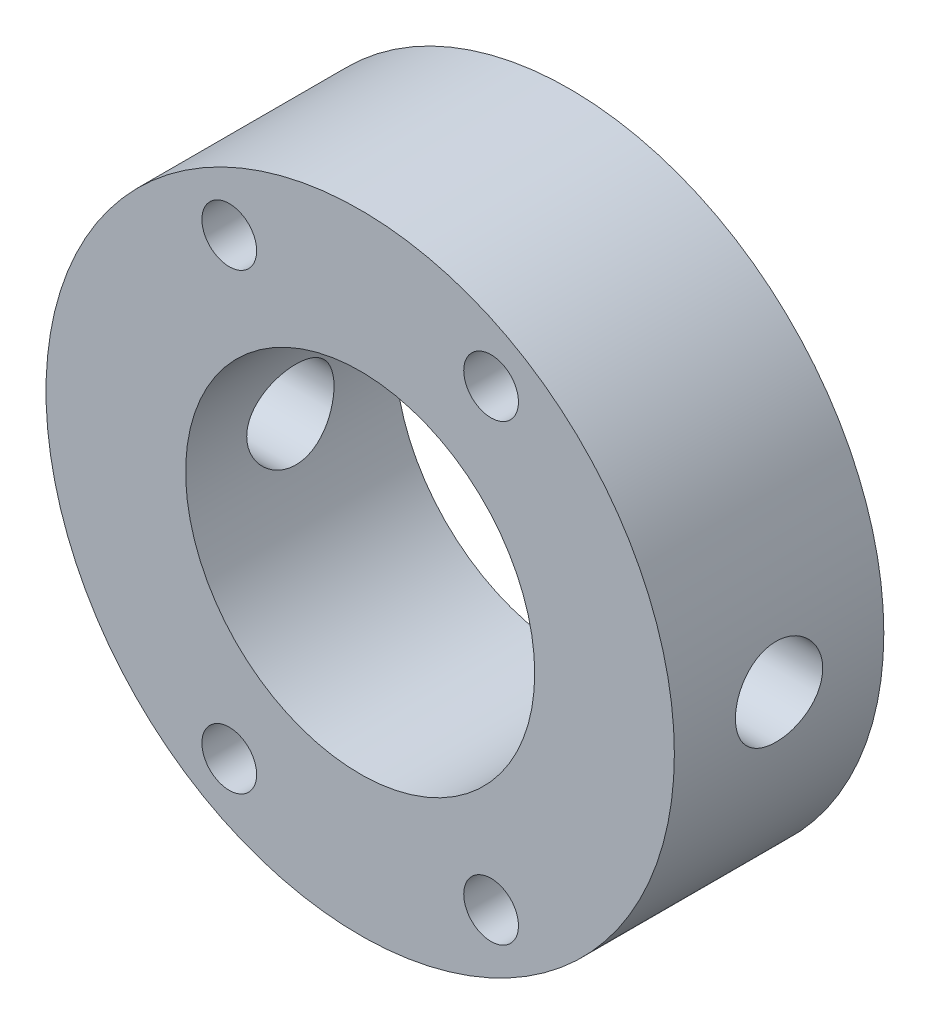
ISO-10303-21;
HEADER;
FILE_DESCRIPTION(('STEP AP214'),'2;1');
FILE_NAME('part.step','',(''),(''),'','','');
FILE_SCHEMA(('AUTOMOTIVE_DESIGN { 1 0 10303 214 1 1 1 1 }'));
ENDSEC;
DATA;
#1=APPLICATION_CONTEXT('core data for automotive mechanical design processes');
#2=APPLICATION_PROTOCOL_DEFINITION('international standard','automotive_design',2000,#1);
#3=PRODUCT_CONTEXT('',#1,'mechanical');
#4=PRODUCT('Part','Part','',(#3));
#5=PRODUCT_RELATED_PRODUCT_CATEGORY('part','',(#4));
#6=PRODUCT_DEFINITION_FORMATION('','',#4);
#7=PRODUCT_DEFINITION_CONTEXT('part definition',#1,'design');
#8=PRODUCT_DEFINITION('design','',#6,#7);
#9=PRODUCT_DEFINITION_SHAPE('','',#8);
#10=(LENGTH_UNIT() NAMED_UNIT(*) SI_UNIT(.MILLI.,.METRE.));
#11=(NAMED_UNIT(*) PLANE_ANGLE_UNIT() SI_UNIT($,.RADIAN.));
#12=(NAMED_UNIT(*) SI_UNIT($,.STERADIAN.) SOLID_ANGLE_UNIT());
#13=UNCERTAINTY_MEASURE_WITH_UNIT(LENGTH_MEASURE(1.E-05),#10,'distance_accuracy_value','');
#14=(GEOMETRIC_REPRESENTATION_CONTEXT(3) GLOBAL_UNCERTAINTY_ASSIGNED_CONTEXT((#13)) GLOBAL_UNIT_ASSIGNED_CONTEXT((#10,
#11,#12)) REPRESENTATION_CONTEXT('',''));
#15=CARTESIAN_POINT('',(0.,0.,0.));
#16=DIRECTION('',(0.,0.,1.));
#17=DIRECTION('',(1.,0.,0.));
#18=AXIS2_PLACEMENT_3D('',#15,#16,#17);
#19=CARTESIAN_POINT('',(0.,0.,76.2));
#20=DIRECTION('',(0.,0.,1.));
#21=DIRECTION('',(1.,0.,0.));
#22=AXIS2_PLACEMENT_3D('',#19,#20,#21);
#23=PLANE('',#22);
#24=CARTESIAN_POINT('',(11.90625,20.6222299276169,76.2));
#25=DIRECTION('',(0.,0.,-1.));
#26=DIRECTION('',(-1.,0.,0.));
#27=AXIS2_PLACEMENT_3D('',#24,#25,#26);
#28=CIRCLE('',#27,2.4892);
#29=CARTESIAN_POINT('',(9.41705000000003,20.6222299276169,76.2));
#30=VERTEX_POINT('',#29);
#31=EDGE_CURVE('E116',#30,#30,#28,.T.);
#32=ORIENTED_EDGE('',*,*,#31,.T.);
#33=EDGE_LOOP('',(#32));
#34=FACE_BOUND('',#33,.T.);
#35=CARTESIAN_POINT('',(-11.90625,20.6222299276169,76.2));
#36=DIRECTION('',(0.,0.,-1.));
#37=DIRECTION('',(-1.,0.,0.));
#38=AXIS2_PLACEMENT_3D('',#35,#36,#37);
#39=CIRCLE('',#38,2.4892);
#40=CARTESIAN_POINT('',(-14.39545,20.6222299276169,76.2));
#41=VERTEX_POINT('',#40);
#42=EDGE_CURVE('E124',#41,#41,#39,.T.);
#43=ORIENTED_EDGE('',*,*,#42,.T.);
#44=EDGE_LOOP('',(#43));
#45=FACE_BOUND('',#44,.T.);
#46=CARTESIAN_POINT('',(-11.90625,-20.6222299276169,76.2));
#47=DIRECTION('',(0.,0.,-1.));
#48=DIRECTION('',(-1.,0.,0.));
#49=AXIS2_PLACEMENT_3D('',#46,#47,#48);
#50=CIRCLE('',#49,2.4892);
#51=CARTESIAN_POINT('',(-14.39545,-20.6222299276169,76.2));
#52=VERTEX_POINT('',#51);
#53=EDGE_CURVE('E132',#52,#52,#50,.T.);
#54=ORIENTED_EDGE('',*,*,#53,.T.);
#55=EDGE_LOOP('',(#54));
#56=FACE_BOUND('',#55,.T.);
#57=CARTESIAN_POINT('',(11.90625,-20.6222299276169,76.2));
#58=DIRECTION('',(0.,0.,-1.));
#59=DIRECTION('',(-1.,0.,0.));
#60=AXIS2_PLACEMENT_3D('',#57,#58,#59);
#61=CIRCLE('',#60,2.4892);
#62=CARTESIAN_POINT('',(9.41705000000003,-20.6222299276169,76.2));
#63=VERTEX_POINT('',#62);
#64=EDGE_CURVE('E76',#63,#63,#61,.T.);
#65=ORIENTED_EDGE('',*,*,#64,.T.);
#66=EDGE_LOOP('',(#65));
#67=FACE_BOUND('',#66,.T.);
#68=CARTESIAN_POINT('',(0.,0.,76.2));
#69=DIRECTION('',(0.,0.,1.));
#70=DIRECTION('',(1.,0.,0.));
#71=AXIS2_PLACEMENT_3D('',#68,#69,#70);
#72=CIRCLE('',#71,28.575);
#73=CARTESIAN_POINT('',(28.575,0.,76.2));
#74=VERTEX_POINT('',#73);
#75=EDGE_CURVE('E11',#74,#74,#72,.T.);
#76=ORIENTED_EDGE('',*,*,#75,.T.);
#77=EDGE_LOOP('',(#76));
#78=FACE_BOUND('',#77,.T.);
#79=CARTESIAN_POINT('',(0.,0.,76.2));
#80=DIRECTION('',(0.,0.,1.));
#81=DIRECTION('',(1.,0.,0.));
#82=AXIS2_PLACEMENT_3D('',#79,#80,#81);
#83=CIRCLE('',#82,15.875);
#84=CARTESIAN_POINT('',(15.875,0.,76.2));
#85=VERTEX_POINT('',#84);
#86=EDGE_CURVE('E62',#85,#85,#83,.T.);
#87=ORIENTED_EDGE('',*,*,#86,.F.);
#88=EDGE_LOOP('',(#87));
#89=FACE_BOUND('',#88,.T.);
#90=ADVANCED_FACE('F47',(#34,#45,#56,#67,#78,#89),#23,.T.);
#91=CARTESIAN_POINT('',(0.,0.,76.2));
#92=DIRECTION('',(0.,0.,-1.));
#93=DIRECTION('',(-1.,0.,0.));
#94=AXIS2_PLACEMENT_3D('',#91,#92,#93);
#95=CYLINDRICAL_SURFACE('',#94,28.575);
#96=CARTESIAN_POINT('',(-28.575,0.,62.70625));
#97=CARTESIAN_POINT('',(-28.5749966380799,0.221781507374246,62.7062592823873));
#98=CARTESIAN_POINT('',(-28.5723908456345,0.443696332603417,62.7249031021075));
#99=CARTESIAN_POINT('',(-28.5622465420868,0.881336057800153,62.7989742587652));
#100=CARTESIAN_POINT('',(-28.5547030658693,1.09705449879381,62.8544386216006));
#101=CARTESIAN_POINT('',(-28.5355320909199,1.5159035469727,63.0004725497663));
#102=CARTESIAN_POINT('',(-28.5239075227638,1.71904306409921,63.0910169294405));
#103=CARTESIAN_POINT('',(-28.4978627719636,2.10720999076157,63.3045820318031));
#104=CARTESIAN_POINT('',(-28.4834430200263,2.29224018414104,63.4275977520737));
#105=CARTESIAN_POINT('',(-28.4533057682986,2.6402175314521,63.7034980941716));
#106=CARTESIAN_POINT('',(-28.4375809766666,2.80302499715988,63.8565581185751));
#107=CARTESIAN_POINT('',(-28.4066637934732,3.10073114297688,64.1878250757993));
#108=CARTESIAN_POINT('',(-28.3914714308886,3.23562830605567,64.3660333746387));
#109=CARTESIAN_POINT('',(-28.3632681462191,3.47421790993751,64.7434630183215));
#110=CARTESIAN_POINT('',(-28.3502666392005,3.57777712107461,64.9427693477652));
#111=CARTESIAN_POINT('',(-28.3280153354257,3.74990003252723,65.3561564507212));
#112=CARTESIAN_POINT('',(-28.3187653634602,3.81846536721383,65.5702365337028));
#113=CARTESIAN_POINT('',(-28.3051353235856,3.91822454192377,66.0056333741411));
#114=CARTESIAN_POINT('',(-28.3007242894288,3.9496561162155,66.2268946746257));
#115=CARTESIAN_POINT('',(-28.2971772458173,3.9749916313457,66.671591950674));
#116=CARTESIAN_POINT('',(-28.2980409759907,3.96889742452509,66.8950278183534));
#117=CARTESIAN_POINT('',(-28.3049175378396,3.91954905074425,67.3360629115092));
#118=CARTESIAN_POINT('',(-28.3108938684021,3.87655829750464,67.5536922615049));
#119=CARTESIAN_POINT('',(-28.3272652801452,3.75504889501772,67.9786179614526));
#120=CARTESIAN_POINT('',(-28.3376604698953,3.67652937283944,68.1859140573808));
#121=CARTESIAN_POINT('',(-28.3617391543457,3.48591309040819,68.5850981884726));
#122=CARTESIAN_POINT('',(-28.3754336765532,3.37370340961532,68.7769316100489));
#123=CARTESIAN_POINT('',(-28.4045597902803,3.11897261319181,69.139145953191));
#124=CARTESIAN_POINT('',(-28.4199914797105,2.9764497886424,69.3095256644304));
#125=CARTESIAN_POINT('',(-28.4510149231623,2.66368598302018,69.6255238659173));
#126=CARTESIAN_POINT('',(-28.4666069169204,2.49321825520112,69.7709180006475));
#127=CARTESIAN_POINT('',(-28.4960711088999,2.1301800778561,70.0310657333595));
#128=CARTESIAN_POINT('',(-28.5099433014031,1.93760955484361,70.1458192294641));
#129=CARTESIAN_POINT('',(-28.534416489987,1.53564769937591,70.3414344652825));
#130=CARTESIAN_POINT('',(-28.5450159617122,1.3262485856177,70.4222804179323));
#131=CARTESIAN_POINT('',(-28.5617362566092,0.896666412072488,70.5475985288635));
#132=CARTESIAN_POINT('',(-28.5678573390124,0.676483977264895,70.5920727925362));
#133=CARTESIAN_POINT('',(-28.5748971463986,0.233523316092962,70.6430902576704));
#134=CARTESIAN_POINT('',(-28.5758582128866,0.0107812944210778,70.649942187023));
#135=CARTESIAN_POINT('',(-28.5725845237533,-0.432673196608852,70.626337739461));
#136=CARTESIAN_POINT('',(-28.5683499054441,-0.653385719447411,70.5958823485084));
#137=CARTESIAN_POINT('',(-28.5551868949503,-1.08559212430531,70.4987844034597));
#138=CARTESIAN_POINT('',(-28.5462778235004,-1.29712010053069,70.432290767818));
#139=CARTESIAN_POINT('',(-28.5247623311502,-1.7060241982416,70.2651598493133));
#140=CARTESIAN_POINT('',(-28.5121557585272,-1.9033997385845,70.164521165321));
#141=CARTESIAN_POINT('',(-28.4845427921093,-2.27976369833679,69.93122207367));
#142=CARTESIAN_POINT('',(-28.4695217868326,-2.45862851059083,69.798364020068));
#143=CARTESIAN_POINT('',(-28.4388015465277,-2.79163199854151,69.5046747700543));
#144=CARTESIAN_POINT('',(-28.4231022779955,-2.94576945101125,69.3438421906028));
#145=CARTESIAN_POINT('',(-28.3926623224878,-3.22605318415563,68.9974015441374));
#146=CARTESIAN_POINT('',(-28.3779292090548,-3.35199356513988,68.8116261317326));
#147=CARTESIAN_POINT('',(-28.3512194419328,-3.57088108240087,68.421376941228));
#148=CARTESIAN_POINT('',(-28.3392427224193,-3.66382900658895,68.2169036098104));
#149=CARTESIAN_POINT('',(-28.3194552181183,-3.81376736438272,67.7957002421335));
#150=CARTESIAN_POINT('',(-28.3116314750162,-3.87086974800008,67.5790106926109));
#151=CARTESIAN_POINT('',(-28.3010000790171,-3.94785448523437,67.1390015936567));
#152=CARTESIAN_POINT('',(-28.2981921330189,-3.96773901370263,66.9156824324059));
#153=CARTESIAN_POINT('',(-28.2979201137501,-3.96967735660406,66.4708036486144));
#154=CARTESIAN_POINT('',(-28.3004103302688,-3.95205476546149,66.2492453952438));
#155=CARTESIAN_POINT('',(-28.3103552109078,-3.88016873302413,65.8122743682832));
#156=CARTESIAN_POINT('',(-28.3178098713403,-3.82590531894826,65.596861590128));
#157=CARTESIAN_POINT('',(-28.3368285646153,-3.68238634671182,65.178364143307));
#158=CARTESIAN_POINT('',(-28.3483903223698,-3.59315015857066,64.9752727221166));
#159=CARTESIAN_POINT('',(-28.3743236856531,-3.38225059202429,64.5868927225161));
#160=CARTESIAN_POINT('',(-28.3886953586634,-3.26058643482137,64.4016045718189));
#161=CARTESIAN_POINT('',(-28.4187773379285,-2.98709683431868,64.0524416552771));
#162=CARTESIAN_POINT('',(-28.4344977067116,-2.8350309184669,63.8887560938544));
#163=CARTESIAN_POINT('',(-28.4654194899142,-2.50556108903678,63.5891077309964));
#164=CARTESIAN_POINT('',(-28.4806207821262,-2.32815125894102,63.4531514209764));
#165=CARTESIAN_POINT('',(-28.5088720648074,-1.95205966542138,63.212261686268));
#166=CARTESIAN_POINT('',(-28.5219116268462,-1.75328200086485,63.1074768121635));
#167=CARTESIAN_POINT('',(-28.5442668069756,-1.34087044218596,62.9329317439138));
#168=CARTESIAN_POINT('',(-28.5535863686701,-1.12725256396294,62.8631344389539));
#169=CARTESIAN_POINT('',(-28.5652681714033,-0.760504615515881,62.7767899237123));
#170=CARTESIAN_POINT('',(-28.5688993177014,-0.609662446470818,62.7503767405598));
#171=CARTESIAN_POINT('',(-28.5737663796393,-0.305901315807067,62.7151036642324));
#172=CARTESIAN_POINT('',(-28.5750023190145,-0.15298237478334,62.7062435971143));
#173=CARTESIAN_POINT('',(-28.575,0.,62.70625));
#174=B_SPLINE_CURVE_WITH_KNOTS('',3,(#96,#97,#98,#99,#100,#101,#102,#103,#104,#105,#106,#107,
#108,#109,#110,#111,#112,#113,#114,#115,#116,#117,#118,#119,#120,#121,#122,#123,#124,#125,#126,
#127,#128,#129,#130,#131,#132,#133,#134,#135,#136,#137,#138,#139,#140,#141,#142,#143,#144,#145,
#146,#147,#148,#149,#150,#151,#152,#153,#154,#155,#156,#157,#158,#159,#160,#161,#162,#163,#164,
#165,#166,#167,#168,#169,#170,#171,#172,#173),.UNSPECIFIED.,.T.,.F.,(4,2,2,2,2,2,2,2,2,2,2,2,2,
2,2,2,2,2,2,2,2,2,2,2,2,2,2,2,2,2,2,2,2,2,2,2,2,2,4),(0.,0.664785611812881,1.33024073151679,
1.99521897121315,2.6600948264867,3.32897440378443,3.99789032766953,4.66961135951769,
5.34130101610766,6.00866673099711,6.67599950376316,7.33860727880735,8.00123133480551,
8.66610160728767,9.33100937210644,10.0016067085495,10.6722062746336,11.3431177204977,
12.0139903276073,12.6793494508902,13.3446909903669,14.0073039150091,14.6699440330159,
15.336756703103,16.0036023492884,16.6751691706786,17.3467199529259,18.0161628265991,
18.6855665796893,19.349218443361,20.0128698140344,20.6761541330643,21.3394543831215,
22.0082250392847,22.6771520753568,23.3492176786924,24.0205689152322,24.4791350537728,
24.937696648114),.UNSPECIFIED.);
#175=CARTESIAN_POINT('',(-28.575,0.,62.70625));
#176=VERTEX_POINT('',#175);
#177=EDGE_CURVE('E105',#176,#176,#174,.T.);
#178=ORIENTED_EDGE('',*,*,#177,.T.);
#179=EDGE_LOOP('',(#178));
#180=FACE_BOUND('',#179,.T.);
#181=CARTESIAN_POINT('',(28.575,0.,62.70625));
#182=CARTESIAN_POINT('',(28.5749966380799,-0.221781507374246,62.7062592823873));
#183=CARTESIAN_POINT('',(28.5723908456345,-0.443696332603417,62.7249031021075));
#184=CARTESIAN_POINT('',(28.5622465420868,-0.881336057800154,62.7989742587652));
#185=CARTESIAN_POINT('',(28.5547030658693,-1.09705449879381,62.8544386216006));
#186=CARTESIAN_POINT('',(28.5355320909199,-1.5159035469727,63.0004725497663));
#187=CARTESIAN_POINT('',(28.5239075227638,-1.71904306409921,63.0910169294405));
#188=CARTESIAN_POINT('',(28.4978627719636,-2.10720999076157,63.3045820318031));
#189=CARTESIAN_POINT('',(28.4834430200263,-2.29224018414104,63.4275977520737));
#190=CARTESIAN_POINT('',(28.4533057682986,-2.6402175314521,63.7034980941716));
#191=CARTESIAN_POINT('',(28.4375809766666,-2.80302499715988,63.8565581185751));
#192=CARTESIAN_POINT('',(28.4066637934732,-3.10073114297688,64.1878250757993));
#193=CARTESIAN_POINT('',(28.3914714308886,-3.23562830605567,64.3660333746387));
#194=CARTESIAN_POINT('',(28.3632681462191,-3.47421790993751,64.7434630183215));
#195=CARTESIAN_POINT('',(28.3502666392005,-3.57777712107461,64.9427693477652));
#196=CARTESIAN_POINT('',(28.3280153354257,-3.74990003252723,65.3561564507212));
#197=CARTESIAN_POINT('',(28.3187653634602,-3.81846536721383,65.5702365337028));
#198=CARTESIAN_POINT('',(28.3051353235856,-3.91822454192377,66.0056333741411));
#199=CARTESIAN_POINT('',(28.3007242894288,-3.9496561162155,66.2268946746257));
#200=CARTESIAN_POINT('',(28.2971772458173,-3.9749916313457,66.671591950674));
#201=CARTESIAN_POINT('',(28.2980409759907,-3.96889742452509,66.8950278183534));
#202=CARTESIAN_POINT('',(28.3049175378396,-3.91954905074425,67.3360629115092));
#203=CARTESIAN_POINT('',(28.3108938684021,-3.87655829750464,67.5536922615049));
#204=CARTESIAN_POINT('',(28.3272652801452,-3.75504889501772,67.9786179614526));
#205=CARTESIAN_POINT('',(28.3376604698953,-3.67652937283944,68.1859140573808));
#206=CARTESIAN_POINT('',(28.3617391543457,-3.48591309040818,68.5850981884726));
#207=CARTESIAN_POINT('',(28.3754336765532,-3.37370340961532,68.7769316100489));
#208=CARTESIAN_POINT('',(28.4045597902803,-3.11897261319181,69.139145953191));
#209=CARTESIAN_POINT('',(28.4199914797105,-2.9764497886424,69.3095256644304));
#210=CARTESIAN_POINT('',(28.4510149231623,-2.66368598302018,69.6255238659173));
#211=CARTESIAN_POINT('',(28.4666069169204,-2.49321825520112,69.7709180006475));
#212=CARTESIAN_POINT('',(28.4960711088999,-2.1301800778561,70.0310657333595));
#213=CARTESIAN_POINT('',(28.5099433014031,-1.93760955484361,70.1458192294641));
#214=CARTESIAN_POINT('',(28.534416489987,-1.53564769937591,70.3414344652825));
#215=CARTESIAN_POINT('',(28.5450159617122,-1.3262485856177,70.4222804179323));
#216=CARTESIAN_POINT('',(28.5617362566092,-0.896666412072487,70.5475985288635));
#217=CARTESIAN_POINT('',(28.5678573390124,-0.676483977264894,70.5920727925362));
#218=CARTESIAN_POINT('',(28.5748971463986,-0.23352331609296,70.6430902576704));
#219=CARTESIAN_POINT('',(28.5758582128866,-0.0107812944210755,70.649942187023));
#220=CARTESIAN_POINT('',(28.5725845237533,0.432673196608855,70.626337739461));
#221=CARTESIAN_POINT('',(28.5683499054441,0.653385719447413,70.5958823485084));
#222=CARTESIAN_POINT('',(28.5551868949503,1.08559212430531,70.4987844034597));
#223=CARTESIAN_POINT('',(28.5462778235004,1.2971201005307,70.432290767818));
#224=CARTESIAN_POINT('',(28.5247623311502,1.7060241982416,70.2651598493133));
#225=CARTESIAN_POINT('',(28.5121557585272,1.90339973858451,70.164521165321));
#226=CARTESIAN_POINT('',(28.4845427921093,2.27976369833679,69.93122207367));
#227=CARTESIAN_POINT('',(28.4695217868326,2.45862851059083,69.798364020068));
#228=CARTESIAN_POINT('',(28.4388015465277,2.79163199854152,69.5046747700542));
#229=CARTESIAN_POINT('',(28.4231022779955,2.94576945101125,69.3438421906028));
#230=CARTESIAN_POINT('',(28.3926623224878,3.22605318415564,68.9974015441374));
#231=CARTESIAN_POINT('',(28.3779292090548,3.35199356513989,68.8116261317326));
#232=CARTESIAN_POINT('',(28.3512194419328,3.57088108240087,68.421376941228));
#233=CARTESIAN_POINT('',(28.3392427224193,3.66382900658895,68.2169036098104));
#234=CARTESIAN_POINT('',(28.3194552181183,3.81376736438272,67.7957002421335));
#235=CARTESIAN_POINT('',(28.3116314750162,3.87086974800009,67.5790106926109));
#236=CARTESIAN_POINT('',(28.3010000790171,3.94785448523437,67.1390015936567));
#237=CARTESIAN_POINT('',(28.2981921330189,3.96773901370263,66.9156824324059));
#238=CARTESIAN_POINT('',(28.2979201137501,3.96967735660406,66.4708036486144));
#239=CARTESIAN_POINT('',(28.3004103302688,3.95205476546149,66.2492453952438));
#240=CARTESIAN_POINT('',(28.3103552109078,3.88016873302413,65.8122743682832));
#241=CARTESIAN_POINT('',(28.3178098713403,3.82590531894826,65.596861590128));
#242=CARTESIAN_POINT('',(28.3368285646153,3.68238634671182,65.178364143307));
#243=CARTESIAN_POINT('',(28.3483903223698,3.59315015857066,64.9752727221166));
#244=CARTESIAN_POINT('',(28.3743236856531,3.38225059202429,64.5868927225161));
#245=CARTESIAN_POINT('',(28.3886953586634,3.26058643482137,64.4016045718189));
#246=CARTESIAN_POINT('',(28.4187773379285,2.98709683431868,64.0524416552771));
#247=CARTESIAN_POINT('',(28.4344977067116,2.8350309184669,63.8887560938544));
#248=CARTESIAN_POINT('',(28.4654194899142,2.50556108903678,63.5891077309964));
#249=CARTESIAN_POINT('',(28.4806207821262,2.32815125894102,63.4531514209764));
#250=CARTESIAN_POINT('',(28.5088720648074,1.95205966542138,63.212261686268));
#251=CARTESIAN_POINT('',(28.5219116268462,1.75328200086485,63.1074768121635));
#252=CARTESIAN_POINT('',(28.5442668069756,1.34087044218595,62.9329317439138));
#253=CARTESIAN_POINT('',(28.5535863686701,1.12725256396293,62.8631344389539));
#254=CARTESIAN_POINT('',(28.5652681714033,0.760504615515874,62.7767899237123));
#255=CARTESIAN_POINT('',(28.5688993177014,0.609662446470813,62.7503767405598));
#256=CARTESIAN_POINT('',(28.5737663796393,0.305901315807065,62.7151036642324));
#257=CARTESIAN_POINT('',(28.5750023190144,0.152982374783339,62.7062435971143));
#258=CARTESIAN_POINT('',(28.575,0.,62.70625));
#259=B_SPLINE_CURVE_WITH_KNOTS('',3,(#181,#182,#183,#184,#185,#186,#187,#188,#189,#190,#191,
#192,#193,#194,#195,#196,#197,#198,#199,#200,#201,#202,#203,#204,#205,#206,#207,#208,#209,#210,
#211,#212,#213,#214,#215,#216,#217,#218,#219,#220,#221,#222,#223,#224,#225,#226,#227,#228,#229,
#230,#231,#232,#233,#234,#235,#236,#237,#238,#239,#240,#241,#242,#243,#244,#245,#246,#247,#248,
#249,#250,#251,#252,#253,#254,#255,#256,#257,#258),.UNSPECIFIED.,.T.,.F.,(4,2,2,2,2,2,2,2,2,2,2,
2,2,2,2,2,2,2,2,2,2,2,2,2,2,2,2,2,2,2,2,2,2,2,2,2,2,2,4),(0.,0.664785611812881,1.33024073151679,
1.99521897121315,2.66009482648671,3.32897440378443,3.99789032766953,4.66961135951769,
5.34130101610766,6.00866673099711,6.67599950376316,7.33860727880735,8.00123133480551,
8.66610160728767,9.33100937210644,10.0016067085495,10.6722062746336,11.3431177204977,
12.0139903276073,12.6793494508902,13.3446909903669,14.0073039150091,14.6699440330159,
15.336756703103,16.0036023492884,16.6751691706786,17.3467199529259,18.0161628265991,
18.6855665796893,19.349218443361,20.0128698140344,20.6761541330643,21.3394543831215,
22.0082250392847,22.6771520753568,23.3492176786924,24.0205689152322,24.4791350537728,
24.937696648114),.UNSPECIFIED.);
#260=CARTESIAN_POINT('',(28.575,0.,62.70625));
#261=VERTEX_POINT('',#260);
#262=EDGE_CURVE('E99',#261,#261,#259,.T.);
#263=ORIENTED_EDGE('',*,*,#262,.T.);
#264=EDGE_LOOP('',(#263));
#265=FACE_BOUND('',#264,.T.);
#266=CARTESIAN_POINT('',(0.,0.,57.15));
#267=DIRECTION('',(0.,0.,1.));
#268=DIRECTION('',(1.,0.,0.));
#269=AXIS2_PLACEMENT_3D('',#266,#267,#268);
#270=CIRCLE('',#269,28.575);
#271=CARTESIAN_POINT('',(28.575,0.,57.15));
#272=VERTEX_POINT('',#271);
#273=EDGE_CURVE('E69',#272,#272,#270,.T.);
#274=ORIENTED_EDGE('',*,*,#273,.T.);
#275=EDGE_LOOP('',(#274));
#276=FACE_BOUND('',#275,.T.);
#277=ORIENTED_EDGE('',*,*,#75,.F.);
#278=EDGE_LOOP('',(#277));
#279=FACE_BOUND('',#278,.T.);
#280=ADVANCED_FACE('F49',(#180,#265,#276,#279),#95,.T.);
#281=CARTESIAN_POINT('',(0.,0.,76.2));
#282=DIRECTION('',(0.,0.,-1.));
#283=DIRECTION('',(-1.,0.,0.));
#284=AXIS2_PLACEMENT_3D('',#281,#282,#283);
#285=CYLINDRICAL_SURFACE('',#284,15.875);
#286=CARTESIAN_POINT('',(-15.875,0.,70.64375));
#287=CARTESIAN_POINT('',(-15.8749962923412,-0.219276317938663,70.6437438464845));
#288=CARTESIAN_POINT('',(-15.8704115464046,-0.438621375927227,70.6255161052444));
#289=CARTESIAN_POINT('',(-15.8525663450826,-0.8710250649762,70.5531959538336));
#290=CARTESIAN_POINT('',(-15.8393009725702,-1.08408006151216,70.4990832164311));
#291=CARTESIAN_POINT('',(-15.8055634467017,-1.49759689098307,70.3568378085482));
#292=CARTESIAN_POINT('',(-15.7850999501961,-1.69807351157521,70.2687459908992));
#293=CARTESIAN_POINT('',(-15.73914555491,-2.08140334899713,70.0611867388397));
#294=CARTESIAN_POINT('',(-15.7136544865579,-2.26425597108944,69.9417182461019));
#295=CARTESIAN_POINT('',(-15.6598253179469,-2.61091343265034,69.6721979107067));
#296=CARTESIAN_POINT('',(-15.6314432932942,-2.77430359661987,69.5216214579208));
#297=CARTESIAN_POINT('',(-15.5753228656204,-3.07379403655877,69.1952827078449));
#298=CARTESIAN_POINT('',(-15.5475845355861,-3.20989123109472,69.0195175705362));
#299=CARTESIAN_POINT('',(-15.4954492736807,-3.45288272782228,68.6445709625917));
#300=CARTESIAN_POINT('',(-15.4711081035481,-3.55931315463526,68.4450804101519));
#301=CARTESIAN_POINT('',(-15.42916371706,-3.7369668205405,68.0303323274828));
#302=CARTESIAN_POINT('',(-15.4115594235815,-3.80819568835203,67.8150773243091));
#303=CARTESIAN_POINT('',(-15.3855334459235,-3.91200967237926,67.3794703276748));
#304=CARTESIAN_POINT('',(-15.3769348659626,-3.94534037662855,67.1593068375662));
#305=CARTESIAN_POINT('',(-15.3693643817434,-3.9747342798632,66.7163581611892));
#306=CARTESIAN_POINT('',(-15.3703909113223,-3.97080354189374,66.4935734073354));
#307=CARTESIAN_POINT('',(-15.3817956459658,-3.92638101310921,66.0574206753404));
#308=CARTESIAN_POINT('',(-15.3919465837346,-3.88677769175438,65.843955334873));
#309=CARTESIAN_POINT('',(-15.4200941933804,-3.77355149451416,65.4267988861312));
#310=CARTESIAN_POINT('',(-15.4380914241861,-3.69992619505859,65.2231084753193));
#311=CARTESIAN_POINT('',(-15.4801123887539,-3.51998882704212,64.8289014986663));
#312=CARTESIAN_POINT('',(-15.5041951226389,-3.41335430705376,64.6385386704735));
#313=CARTESIAN_POINT('',(-15.5556402661335,-3.17065098028954,64.2780900804351));
#314=CARTESIAN_POINT('',(-15.5830032492704,-3.03457702289004,64.1080078749054));
#315=CARTESIAN_POINT('',(-15.638882672618,-2.73225531113572,63.7878571001419));
#316=CARTESIAN_POINT('',(-15.6674097549388,-2.56525780806383,63.638497495046));
#317=CARTESIAN_POINT('',(-15.7216995059379,-2.20824403172853,63.3697687959809));
#318=CARTESIAN_POINT('',(-15.7474620901614,-2.01822705560226,63.2504006180943));
#319=CARTESIAN_POINT('',(-15.7934483283255,-1.61955662213617,63.044782823948));
#320=CARTESIAN_POINT('',(-15.8136526533794,-1.41084139453114,62.9586483705768));
#321=CARTESIAN_POINT('',(-15.8461053037312,-0.981276104878039,62.8228854619768));
#322=CARTESIAN_POINT('',(-15.8583551508518,-0.76042837275232,62.7732500236437));
#323=CARTESIAN_POINT('',(-15.8732934182218,-0.318928671656945,62.7129768577923));
#324=CARTESIAN_POINT('',(-15.8762184990732,-0.0984163216354722,62.7013736601758));
#325=CARTESIAN_POINT('',(-15.8728517107157,0.341399481245657,62.7148463179385));
#326=CARTESIAN_POINT('',(-15.8665606711907,0.560703041142993,62.7399188715727));
#327=CARTESIAN_POINT('',(-15.8456201673278,0.988521086137795,62.8252355284522));
#328=CARTESIAN_POINT('',(-15.8310959461656,1.19714729393815,62.8849529262828));
#329=CARTESIAN_POINT('',(-15.7953261963621,1.60140991961394,63.0372624931587));
#330=CARTESIAN_POINT('',(-15.7740799889558,1.79704502327388,63.1298579822454));
#331=CARTESIAN_POINT('',(-15.7266562722145,2.17361329317892,63.3471664243143));
#332=CARTESIAN_POINT('',(-15.7003979490741,2.35422398152379,63.4724201307159));
#333=CARTESIAN_POINT('',(-15.6459901389264,2.69220583193126,63.7507983003592));
#334=CARTESIAN_POINT('',(-15.6178403260695,2.84957297478339,63.9039275735717));
#335=CARTESIAN_POINT('',(-15.5619703195514,3.14057921135843,64.2381926880657));
#336=CARTESIAN_POINT('',(-15.5342776314873,3.27354106641412,64.4199237141865));
#337=CARTESIAN_POINT('',(-15.4832282405322,3.50708054989026,64.803688428698));
#338=CARTESIAN_POINT('',(-15.4598713451923,3.60765961580221,65.0057212153588));
#339=CARTESIAN_POINT('',(-15.4203954226879,3.77282980035675,65.4232713905337));
#340=CARTESIAN_POINT('',(-15.4042336277389,3.83763413278553,65.638700183245));
#341=CARTESIAN_POINT('',(-15.3809367690691,3.92997705859963,66.0778609168235));
#342=CARTESIAN_POINT('',(-15.3737997312575,3.95752380186565,66.3015910308201));
#343=CARTESIAN_POINT('',(-15.3695109277681,3.97414377026342,66.7441118756505));
#344=CARTESIAN_POINT('',(-15.3720782188607,3.96429943786922,66.9628598804844));
#345=CARTESIAN_POINT('',(-15.3862592576868,3.90889404885912,67.3954707054703));
#346=CARTESIAN_POINT('',(-15.3978728236181,3.8633337100242,67.6093336237087));
#347=CARTESIAN_POINT('',(-15.428681272623,3.73838078269612,68.0249265479296));
#348=CARTESIAN_POINT('',(-15.447830611566,3.65919121655115,68.2267212034442));
#349=CARTESIAN_POINT('',(-15.4915593701141,3.46938841724574,68.6143042417671));
#350=CARTESIAN_POINT('',(-15.5161395427502,3.35877082571518,68.8000903998914));
#351=CARTESIAN_POINT('',(-15.5687615732514,3.10585841826937,69.1556132892334));
#352=CARTESIAN_POINT('',(-15.5968770070148,2.96281253520542,69.3248049234339));
#353=CARTESIAN_POINT('',(-15.6529623875501,2.65056771127277,69.6371348893548));
#354=CARTESIAN_POINT('',(-15.680932298193,2.48136256875342,69.7802670255073));
#355=CARTESIAN_POINT('',(-15.7341796390132,2.11790382315061,70.0389424205771));
#356=CARTESIAN_POINT('',(-15.7593991328058,1.9232520757121,70.153939082006));
#357=CARTESIAN_POINT('',(-15.8036928066328,1.51676644912146,70.3493943290302));
#358=CARTESIAN_POINT('',(-15.8227713875774,1.30494501159304,70.4298776625493));
#359=CARTESIAN_POINT('',(-15.8498132426717,0.91125212837335,70.5420754677472));
#360=CARTESIAN_POINT('',(-15.8591933961858,0.731255868860928,70.5801209972455));
#361=CARTESIAN_POINT('',(-15.8717880967619,0.36752231427308,70.6309598924997));
#362=CARTESIAN_POINT('',(-15.8750031075549,0.183785301621088,70.6437551575369));
#363=CARTESIAN_POINT('',(-15.875,0.,70.64375));
#364=B_SPLINE_CURVE_WITH_KNOTS('',3,(#286,#287,#288,#289,#290,#291,#292,#293,#294,#295,#296,
#297,#298,#299,#300,#301,#302,#303,#304,#305,#306,#307,#308,#309,#310,#311,#312,#313,#314,#315,
#316,#317,#318,#319,#320,#321,#322,#323,#324,#325,#326,#327,#328,#329,#330,#331,#332,#333,#334,
#335,#336,#337,#338,#339,#340,#341,#342,#343,#344,#345,#346,#347,#348,#349,#350,#351,#352,#353,
#354,#355,#356,#357,#358,#359,#360,#361,#362,#363),.UNSPECIFIED.,.T.,.F.,(4,2,2,2,2,2,2,2,2,2,2,
2,2,2,2,2,2,2,2,2,2,2,2,2,2,2,2,2,2,2,2,2,2,2,2,2,2,2,4),(0.,0.657155447581874,1.31468346241698,
1.97142338729865,2.62818546669801,3.29709027094096,3.96607055347247,4.64498921631612,
5.3237992851062,5.98901030788246,6.65411309181962,7.30309523339854,7.95212361262678,
8.60770355008421,9.26339827846131,9.93778971322647,10.6122017446498,11.288930225954,
11.9655291997665,12.6248135910374,13.2840386336958,13.9334947632717,14.5830164938234,
15.2440636710878,15.9052250213417,16.5826151394562,17.2599751836686,17.9332534034499,
18.6063843237088,19.2601791898969,19.9139609171721,20.5638505983457,21.2138304488325,
21.8807658760559,22.5478596587193,23.2270349082203,23.9057223346502,24.4565551780547,
25.0073465871824),.UNSPECIFIED.);
#365=CARTESIAN_POINT('',(-15.875,0.,70.64375));
#366=VERTEX_POINT('',#365);
#367=EDGE_CURVE('E52',#366,#366,#364,.T.);
#368=ORIENTED_EDGE('',*,*,#367,.F.);
#369=EDGE_LOOP('',(#368));
#370=FACE_BOUND('',#369,.T.);
#371=CARTESIAN_POINT('',(15.875,0.,62.70625));
#372=CARTESIAN_POINT('',(15.8749962923412,-0.219276317938663,62.7062561535156));
#373=CARTESIAN_POINT('',(15.8704115464046,-0.438621375927227,62.7244838947557));
#374=CARTESIAN_POINT('',(15.8525663450826,-0.8710250649762,62.7968040461665));
#375=CARTESIAN_POINT('',(15.8393009725702,-1.08408006151216,62.8509167835689));
#376=CARTESIAN_POINT('',(15.8055634467017,-1.49759689098307,62.9931621914518));
#377=CARTESIAN_POINT('',(15.7850999501961,-1.69807351157521,63.0812540091008));
#378=CARTESIAN_POINT('',(15.73914555491,-2.08140334899713,63.2888132611603));
#379=CARTESIAN_POINT('',(15.7136544865579,-2.26425597108944,63.4082817538981));
#380=CARTESIAN_POINT('',(15.6598253179469,-2.61091343265034,63.6778020892934));
#381=CARTESIAN_POINT('',(15.6314432932942,-2.77430359661987,63.8283785420792));
#382=CARTESIAN_POINT('',(15.5753228656204,-3.07379403655878,64.1547172921552));
#383=CARTESIAN_POINT('',(15.5475845355861,-3.20989123109473,64.3304824294638));
#384=CARTESIAN_POINT('',(15.4954492736807,-3.45288272782228,64.7054290374083));
#385=CARTESIAN_POINT('',(15.4711081035481,-3.55931315463526,64.9049195898481));
#386=CARTESIAN_POINT('',(15.42916371706,-3.7369668205405,65.3196676725172));
#387=CARTESIAN_POINT('',(15.4115594235815,-3.80819568835203,65.534922675691));
#388=CARTESIAN_POINT('',(15.3855334459235,-3.91200967237926,65.9705296723252));
#389=CARTESIAN_POINT('',(15.3769348659626,-3.94534037662855,66.1906931624339));
#390=CARTESIAN_POINT('',(15.3693643817434,-3.9747342798632,66.6336418388108));
#391=CARTESIAN_POINT('',(15.3703909113223,-3.97080354189374,66.8564265926646));
#392=CARTESIAN_POINT('',(15.3817956459658,-3.92638101310921,67.2925793246596));
#393=CARTESIAN_POINT('',(15.3919465837346,-3.88677769175438,67.506044665127));
#394=CARTESIAN_POINT('',(15.4200941933804,-3.77355149451416,67.9232011138689));
#395=CARTESIAN_POINT('',(15.4380914241861,-3.69992619505859,68.1268915246807));
#396=CARTESIAN_POINT('',(15.4801123887539,-3.51998882704212,68.5210985013338));
#397=CARTESIAN_POINT('',(15.5041951226389,-3.41335430705376,68.7114613295266));
#398=CARTESIAN_POINT('',(15.5556402661335,-3.17065098028954,69.0719099195649));
#399=CARTESIAN_POINT('',(15.5830032492704,-3.03457702289004,69.2419921250946));
#400=CARTESIAN_POINT('',(15.638882672618,-2.73225531113572,69.5621428998581));
#401=CARTESIAN_POINT('',(15.6674097549388,-2.56525780806383,69.711502504954));
#402=CARTESIAN_POINT('',(15.7216995059379,-2.20824403172853,69.9802312040191));
#403=CARTESIAN_POINT('',(15.7474620901614,-2.01822705560226,70.0995993819057));
#404=CARTESIAN_POINT('',(15.7934483283255,-1.61955662213618,70.305217176052));
#405=CARTESIAN_POINT('',(15.8136526533794,-1.41084139453114,70.3913516294232));
#406=CARTESIAN_POINT('',(15.8461053037312,-0.981276104878039,70.5271145380233));
#407=CARTESIAN_POINT('',(15.8583551508518,-0.760428372752321,70.5767499763563));
#408=CARTESIAN_POINT('',(15.8732934182218,-0.318928671656945,70.6370231422078));
#409=CARTESIAN_POINT('',(15.8762184990732,-0.0984163216354715,70.6486263398242));
#410=CARTESIAN_POINT('',(15.8728517107157,0.341399481245658,70.6351536820615));
#411=CARTESIAN_POINT('',(15.8665606711907,0.560703041142994,70.6100811284273));
#412=CARTESIAN_POINT('',(15.8456201673278,0.988521086137796,70.5247644715478));
#413=CARTESIAN_POINT('',(15.8310959461656,1.19714729393815,70.4650470737172));
#414=CARTESIAN_POINT('',(15.7953261963621,1.60140991961394,70.3127375068414));
#415=CARTESIAN_POINT('',(15.7740799889558,1.79704502327389,70.2201420177546));
#416=CARTESIAN_POINT('',(15.7266562722145,2.17361329317892,70.0028335756858));
#417=CARTESIAN_POINT('',(15.7003979490741,2.35422398152379,69.8775798692841));
#418=CARTESIAN_POINT('',(15.6459901389264,2.69220583193126,69.5992016996408));
#419=CARTESIAN_POINT('',(15.6178403260695,2.84957297478339,69.4460724264283));
#420=CARTESIAN_POINT('',(15.5619703195514,3.14057921135843,69.1118073119343));
#421=CARTESIAN_POINT('',(15.5342776314873,3.27354106641412,68.9300762858135));
#422=CARTESIAN_POINT('',(15.4832282405322,3.50708054989026,68.546311571302));
#423=CARTESIAN_POINT('',(15.4598713451923,3.60765961580221,68.3442787846412));
#424=CARTESIAN_POINT('',(15.4203954226879,3.77282980035675,67.9267286094663));
#425=CARTESIAN_POINT('',(15.4042336277389,3.83763413278553,67.711299816755));
#426=CARTESIAN_POINT('',(15.3809367690691,3.92997705859963,67.2721390831765));
#427=CARTESIAN_POINT('',(15.3737997312575,3.95752380186565,67.0484089691799));
#428=CARTESIAN_POINT('',(15.3695109277681,3.97414377026342,66.6058881243495));
#429=CARTESIAN_POINT('',(15.3720782188607,3.96429943786922,66.3871401195156));
#430=CARTESIAN_POINT('',(15.3862592576868,3.90889404885912,65.9545292945297));
#431=CARTESIAN_POINT('',(15.3978728236181,3.86333371002421,65.7406663762914));
#432=CARTESIAN_POINT('',(15.428681272623,3.73838078269612,65.3250734520704));
#433=CARTESIAN_POINT('',(15.447830611566,3.65919121655116,65.1232787965558));
#434=CARTESIAN_POINT('',(15.4915593701141,3.46938841724575,64.7356957582329));
#435=CARTESIAN_POINT('',(15.5161395427502,3.35877082571518,64.5499096001086));
#436=CARTESIAN_POINT('',(15.5687615732514,3.10585841826936,64.1943867107666));
#437=CARTESIAN_POINT('',(15.5968770070148,2.9628125352054,64.0251950765661));
#438=CARTESIAN_POINT('',(15.6529623875501,2.65056771127275,63.7128651106452));
#439=CARTESIAN_POINT('',(15.680932298193,2.48136256875341,63.5697329744927));
#440=CARTESIAN_POINT('',(15.7341796390132,2.11790382315061,63.3110575794229));
#441=CARTESIAN_POINT('',(15.7593991328058,1.9232520757121,63.196060917994));
#442=CARTESIAN_POINT('',(15.8036928066328,1.51676644912146,63.0006056709698));
#443=CARTESIAN_POINT('',(15.8227713875774,1.30494501159303,62.9201223374508));
#444=CARTESIAN_POINT('',(15.8498132426717,0.911252128373351,62.8079245322528));
#445=CARTESIAN_POINT('',(15.8591933961858,0.73125586886093,62.7698790027545));
#446=CARTESIAN_POINT('',(15.8717880967619,0.367522314273082,62.7190401075003));
#447=CARTESIAN_POINT('',(15.8750031075549,0.183785301621089,62.7062448424631));
#448=CARTESIAN_POINT('',(15.875,0.,62.70625));
#449=B_SPLINE_CURVE_WITH_KNOTS('',3,(#371,#372,#373,#374,#375,#376,#377,#378,#379,#380,#381,
#382,#383,#384,#385,#386,#387,#388,#389,#390,#391,#392,#393,#394,#395,#396,#397,#398,#399,#400,
#401,#402,#403,#404,#405,#406,#407,#408,#409,#410,#411,#412,#413,#414,#415,#416,#417,#418,#419,
#420,#421,#422,#423,#424,#425,#426,#427,#428,#429,#430,#431,#432,#433,#434,#435,#436,#437,#438,
#439,#440,#441,#442,#443,#444,#445,#446,#447,#448),.UNSPECIFIED.,.T.,.F.,(4,2,2,2,2,2,2,2,2,2,2,
2,2,2,2,2,2,2,2,2,2,2,2,2,2,2,2,2,2,2,2,2,2,2,2,2,2,2,4),(0.,0.657155447581875,1.31468346241698,
1.97142338729866,2.62818546669801,3.29709027094096,3.96607055347247,4.64498921631612,
5.3237992851062,5.98901030788247,6.65411309181962,7.30309523339854,7.95212361262678,
8.60770355008422,9.26339827846131,9.93778971322648,10.6122017446498,11.288930225954,
11.9655291997665,12.6248135910374,13.2840386336958,13.9334947632717,14.5830164938234,
15.2440636710878,15.9052250213417,16.5826151394563,17.2599751836686,17.9332534034499,
18.6063843237088,19.2601791898969,19.9139609171721,20.5638505983457,21.2138304488325,
21.8807658760559,22.5478596587193,23.2270349082203,23.9057223346502,24.4565551780547,
25.0073465871824),.UNSPECIFIED.);
#450=CARTESIAN_POINT('',(15.875,0.,62.70625));
#451=VERTEX_POINT('',#450);
#452=EDGE_CURVE('E77',#451,#451,#449,.T.);
#453=ORIENTED_EDGE('',*,*,#452,.F.);
#454=EDGE_LOOP('',(#453));
#455=FACE_BOUND('',#454,.T.);
#456=CARTESIAN_POINT('',(0.,0.,57.15));
#457=DIRECTION('',(0.,0.,1.));
#458=DIRECTION('',(1.,0.,0.));
#459=AXIS2_PLACEMENT_3D('',#456,#457,#458);
#460=CIRCLE('',#459,15.875);
#461=CARTESIAN_POINT('',(15.875,0.,57.15));
#462=VERTEX_POINT('',#461);
#463=EDGE_CURVE('E73',#462,#462,#460,.T.);
#464=ORIENTED_EDGE('',*,*,#463,.F.);
#465=EDGE_LOOP('',(#464));
#466=FACE_BOUND('',#465,.T.);
#467=ORIENTED_EDGE('',*,*,#86,.T.);
#468=EDGE_LOOP('',(#467));
#469=FACE_BOUND('',#468,.T.);
#470=ADVANCED_FACE('F83',(#370,#455,#466,#469),#285,.F.);
#471=CARTESIAN_POINT('',(0.,0.,57.15));
#472=DIRECTION('',(0.,0.,1.));
#473=DIRECTION('',(1.,0.,0.));
#474=AXIS2_PLACEMENT_3D('',#471,#472,#473);
#475=PLANE('',#474);
#476=CARTESIAN_POINT('',(11.90625,20.6222299276169,57.15));
#477=DIRECTION('',(0.,0.,-1.));
#478=DIRECTION('',(-1.,0.,0.));
#479=AXIS2_PLACEMENT_3D('',#476,#477,#478);
#480=CIRCLE('',#479,2.48919999999999);
#481=CARTESIAN_POINT('',(9.41705000000004,20.6222299276169,57.15));
#482=VERTEX_POINT('',#481);
#483=EDGE_CURVE('E112',#482,#482,#480,.T.);
#484=ORIENTED_EDGE('',*,*,#483,.F.);
#485=EDGE_LOOP('',(#484));
#486=FACE_BOUND('',#485,.T.);
#487=CARTESIAN_POINT('',(-11.90625,20.6222299276169,57.15));
#488=DIRECTION('',(0.,0.,-1.));
#489=DIRECTION('',(-1.,0.,0.));
#490=AXIS2_PLACEMENT_3D('',#487,#488,#489);
#491=CIRCLE('',#490,2.48919999999999);
#492=CARTESIAN_POINT('',(-14.39545,20.6222299276169,57.15));
#493=VERTEX_POINT('',#492);
#494=EDGE_CURVE('E120',#493,#493,#491,.T.);
#495=ORIENTED_EDGE('',*,*,#494,.F.);
#496=EDGE_LOOP('',(#495));
#497=FACE_BOUND('',#496,.T.);
#498=CARTESIAN_POINT('',(-11.90625,-20.6222299276169,57.15));
#499=DIRECTION('',(0.,0.,-1.));
#500=DIRECTION('',(-1.,0.,0.));
#501=AXIS2_PLACEMENT_3D('',#498,#499,#500);
#502=CIRCLE('',#501,2.48919999999999);
#503=CARTESIAN_POINT('',(-14.39545,-20.6222299276169,57.15));
#504=VERTEX_POINT('',#503);
#505=EDGE_CURVE('E128',#504,#504,#502,.T.);
#506=ORIENTED_EDGE('',*,*,#505,.F.);
#507=EDGE_LOOP('',(#506));
#508=FACE_BOUND('',#507,.T.);
#509=CARTESIAN_POINT('',(11.90625,-20.6222299276169,57.15));
#510=DIRECTION('',(0.,0.,-1.));
#511=DIRECTION('',(-1.,0.,0.));
#512=AXIS2_PLACEMENT_3D('',#509,#510,#511);
#513=CIRCLE('',#512,2.48919999999999);
#514=CARTESIAN_POINT('',(9.41705000000004,-20.6222299276169,57.15));
#515=VERTEX_POINT('',#514);
#516=EDGE_CURVE('E136',#515,#515,#513,.T.);
#517=ORIENTED_EDGE('',*,*,#516,.F.);
#518=EDGE_LOOP('',(#517));
#519=FACE_BOUND('',#518,.T.);
#520=ORIENTED_EDGE('',*,*,#463,.T.);
#521=EDGE_LOOP('',(#520));
#522=FACE_BOUND('',#521,.T.);
#523=ORIENTED_EDGE('',*,*,#273,.F.);
#524=EDGE_LOOP('',(#523));
#525=FACE_BOUND('',#524,.T.);
#526=ADVANCED_FACE('F148',(#486,#497,#508,#519,#522,#525),#475,.F.);
#527=CARTESIAN_POINT('',(11.90625,-20.6222299276169,57.15));
#528=DIRECTION('',(0.,0.,-1.));
#529=DIRECTION('',(-1.,0.,0.));
#530=AXIS2_PLACEMENT_3D('',#527,#528,#529);
#531=CYLINDRICAL_SURFACE('',#530,2.48919999999999);
#532=ORIENTED_EDGE('',*,*,#64,.F.);
#533=EDGE_LOOP('',(#532));
#534=FACE_BOUND('',#533,.T.);
#535=ORIENTED_EDGE('',*,*,#516,.T.);
#536=EDGE_LOOP('',(#535));
#537=FACE_BOUND('',#536,.T.);
#538=ADVANCED_FACE('F150',(#534,#537),#531,.F.);
#539=CARTESIAN_POINT('',(-11.90625,-20.6222299276169,57.15));
#540=DIRECTION('',(0.,0.,-1.));
#541=DIRECTION('',(-1.,0.,0.));
#542=AXIS2_PLACEMENT_3D('',#539,#540,#541);
#543=CYLINDRICAL_SURFACE('',#542,2.48919999999999);
#544=ORIENTED_EDGE('',*,*,#53,.F.);
#545=EDGE_LOOP('',(#544));
#546=FACE_BOUND('',#545,.T.);
#547=ORIENTED_EDGE('',*,*,#505,.T.);
#548=EDGE_LOOP('',(#547));
#549=FACE_BOUND('',#548,.T.);
#550=ADVANCED_FACE('F156',(#546,#549),#543,.F.);
#551=CARTESIAN_POINT('',(-11.90625,20.6222299276169,57.15));
#552=DIRECTION('',(0.,0.,-1.));
#553=DIRECTION('',(-1.,0.,0.));
#554=AXIS2_PLACEMENT_3D('',#551,#552,#553);
#555=CYLINDRICAL_SURFACE('',#554,2.48919999999999);
#556=ORIENTED_EDGE('',*,*,#42,.F.);
#557=EDGE_LOOP('',(#556));
#558=FACE_BOUND('',#557,.T.);
#559=ORIENTED_EDGE('',*,*,#494,.T.);
#560=EDGE_LOOP('',(#559));
#561=FACE_BOUND('',#560,.T.);
#562=ADVANCED_FACE('F187',(#558,#561),#555,.F.);
#563=CARTESIAN_POINT('',(11.90625,20.6222299276169,57.15));
#564=DIRECTION('',(0.,0.,-1.));
#565=DIRECTION('',(-1.,0.,0.));
#566=AXIS2_PLACEMENT_3D('',#563,#564,#565);
#567=CYLINDRICAL_SURFACE('',#566,2.48919999999999);
#568=ORIENTED_EDGE('',*,*,#31,.F.);
#569=EDGE_LOOP('',(#568));
#570=FACE_BOUND('',#569,.T.);
#571=ORIENTED_EDGE('',*,*,#483,.T.);
#572=EDGE_LOOP('',(#571));
#573=FACE_BOUND('',#572,.T.);
#574=ADVANCED_FACE('F92',(#570,#573),#567,.F.);
#575=CARTESIAN_POINT('',(-28.575,0.,66.675));
#576=DIRECTION('',(1.,0.,0.));
#577=DIRECTION('',(0.,0.,-1.));
#578=AXIS2_PLACEMENT_3D('',#575,#576,#577);
#579=CYLINDRICAL_SURFACE('',#578,3.96874999999999);
#580=ORIENTED_EDGE('',*,*,#452,.T.);
#581=EDGE_LOOP('',(#580));
#582=FACE_BOUND('',#581,.T.);
#583=ORIENTED_EDGE('',*,*,#262,.F.);
#584=EDGE_LOOP('',(#583));
#585=FACE_BOUND('',#584,.T.);
#586=ADVANCED_FACE('F90',(#582,#585),#579,.F.);
#587=ORIENTED_EDGE('',*,*,#367,.T.);
#588=EDGE_LOOP('',(#587));
#589=FACE_BOUND('',#588,.T.);
#590=ORIENTED_EDGE('',*,*,#177,.F.);
#591=EDGE_LOOP('',(#590));
#592=FACE_BOUND('',#591,.T.);
#593=ADVANCED_FACE('F86',(#589,#592),#579,.F.);
#594=CLOSED_SHELL('',(#90,#280,#470,#526,#538,#550,#562,#574,#586,#593));
#595=MANIFOLD_SOLID_BREP('B2',#594);
#596=ADVANCED_BREP_SHAPE_REPRESENTATION('',(#18,#595),#14);
#597=SHAPE_DEFINITION_REPRESENTATION(#9,#596);
ENDSEC;
END-ISO-10303-21;
